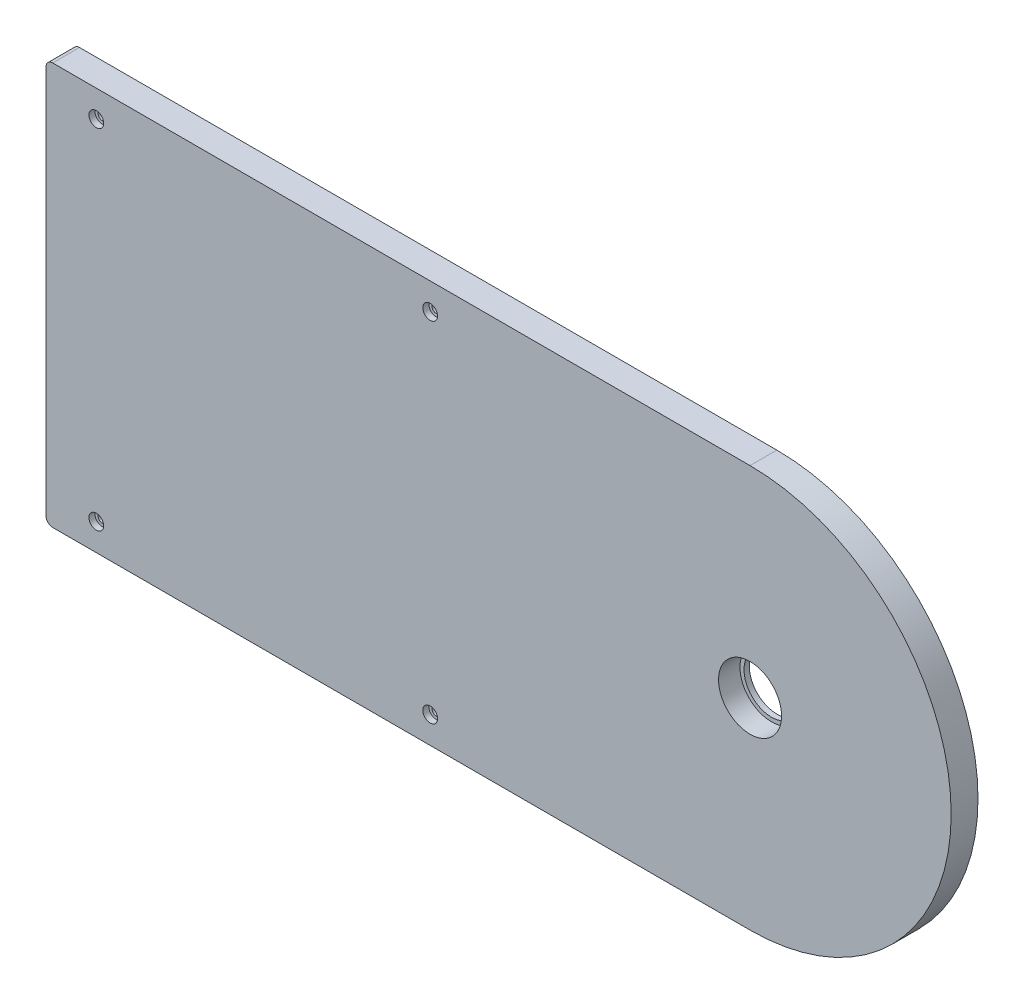
ISO-10303-21;
HEADER;
FILE_DESCRIPTION(('STEP AP214'),'2;1');
FILE_NAME('part.step','',(''),(''),'','','');
FILE_SCHEMA(('AUTOMOTIVE_DESIGN { 1 0 10303 214 1 1 1 1 }'));
ENDSEC;
DATA;
#1=APPLICATION_CONTEXT('core data for automotive mechanical design processes');
#2=APPLICATION_PROTOCOL_DEFINITION('international standard','automotive_design',2000,#1);
#3=PRODUCT_CONTEXT('',#1,'mechanical');
#4=PRODUCT('Part','Part','',(#3));
#5=PRODUCT_RELATED_PRODUCT_CATEGORY('part','',(#4));
#6=PRODUCT_DEFINITION_FORMATION('','',#4);
#7=PRODUCT_DEFINITION_CONTEXT('part definition',#1,'design');
#8=PRODUCT_DEFINITION('design','',#6,#7);
#9=PRODUCT_DEFINITION_SHAPE('','',#8);
#10=(LENGTH_UNIT() NAMED_UNIT(*) SI_UNIT(.MILLI.,.METRE.));
#11=(NAMED_UNIT(*) PLANE_ANGLE_UNIT() SI_UNIT($,.RADIAN.));
#12=(NAMED_UNIT(*) SI_UNIT($,.STERADIAN.) SOLID_ANGLE_UNIT());
#13=UNCERTAINTY_MEASURE_WITH_UNIT(LENGTH_MEASURE(1.E-05),#10,'distance_accuracy_value','');
#14=(GEOMETRIC_REPRESENTATION_CONTEXT(3) GLOBAL_UNCERTAINTY_ASSIGNED_CONTEXT((#13)) GLOBAL_UNIT_ASSIGNED_CONTEXT((#10,
#11,#12)) REPRESENTATION_CONTEXT('',''));
#15=CARTESIAN_POINT('',(0.,0.,0.));
#16=DIRECTION('',(0.,0.,1.));
#17=DIRECTION('',(1.,0.,0.));
#18=AXIS2_PLACEMENT_3D('',#15,#16,#17);
#19=CARTESIAN_POINT('',(-238.5,130.,-3.));
#20=DIRECTION('',(0.,0.,1.));
#21=DIRECTION('',(1.,0.,0.));
#22=AXIS2_PLACEMENT_3D('',#19,#20,#21);
#23=CYLINDRICAL_SURFACE('',#22,3.25000000000001);
#24=CARTESIAN_POINT('',(-238.5,130.,-3.));
#25=DIRECTION('',(0.,0.,1.));
#26=DIRECTION('',(1.,0.,0.));
#27=AXIS2_PLACEMENT_3D('',#24,#25,#26);
#28=CIRCLE('',#27,3.25000000000001);
#29=CARTESIAN_POINT('',(-235.25,130.,-3.));
#30=VERTEX_POINT('',#29);
#31=EDGE_CURVE('E637',#30,#30,#28,.T.);
#32=ORIENTED_EDGE('',*,*,#31,.F.);
#33=EDGE_LOOP('',(#32));
#34=FACE_BOUND('',#33,.T.);
#35=CARTESIAN_POINT('',(-238.5,130.,15.5));
#36=DIRECTION('',(0.,0.,1.));
#37=DIRECTION('',(1.,0.,0.));
#38=AXIS2_PLACEMENT_3D('',#35,#36,#37);
#39=CIRCLE('',#38,3.25000000000001);
#40=CARTESIAN_POINT('',(-235.25,130.,15.5));
#41=VERTEX_POINT('',#40);
#42=EDGE_CURVE('E284',#41,#41,#39,.F.);
#43=ORIENTED_EDGE('',*,*,#42,.F.);
#44=EDGE_LOOP('',(#43));
#45=FACE_BOUND('',#44,.T.);
#46=ADVANCED_FACE('F39',(#34,#45),#23,.F.);
#47=CARTESIAN_POINT('',(-487.5,130.,-3.));
#48=DIRECTION('',(0.,0.,1.));
#49=DIRECTION('',(1.,0.,0.));
#50=AXIS2_PLACEMENT_3D('',#47,#48,#49);
#51=CYLINDRICAL_SURFACE('',#50,3.24999999999995);
#52=CARTESIAN_POINT('',(-487.5,130.,-3.));
#53=DIRECTION('',(0.,0.,1.));
#54=DIRECTION('',(1.,0.,0.));
#55=AXIS2_PLACEMENT_3D('',#52,#53,#54);
#56=CIRCLE('',#55,3.24999999999995);
#57=CARTESIAN_POINT('',(-484.25,130.,-3.));
#58=VERTEX_POINT('',#57);
#59=EDGE_CURVE('E633',#58,#58,#56,.T.);
#60=ORIENTED_EDGE('',*,*,#59,.F.);
#61=EDGE_LOOP('',(#60));
#62=FACE_BOUND('',#61,.T.);
#63=CARTESIAN_POINT('',(-487.5,130.,15.5));
#64=DIRECTION('',(0.,0.,1.));
#65=DIRECTION('',(1.,0.,0.));
#66=AXIS2_PLACEMENT_3D('',#63,#64,#65);
#67=CIRCLE('',#66,3.24999999999995);
#68=CARTESIAN_POINT('',(-484.25,130.,15.5));
#69=VERTEX_POINT('',#68);
#70=EDGE_CURVE('E280',#69,#69,#67,.F.);
#71=ORIENTED_EDGE('',*,*,#70,.F.);
#72=EDGE_LOOP('',(#71));
#73=FACE_BOUND('',#72,.T.);
#74=ADVANCED_FACE('F331',(#62,#73),#51,.F.);
#75=CARTESIAN_POINT('',(-487.5,-130.,-3.));
#76=DIRECTION('',(0.,0.,1.));
#77=DIRECTION('',(1.,0.,0.));
#78=AXIS2_PLACEMENT_3D('',#75,#76,#77);
#79=CYLINDRICAL_SURFACE('',#78,3.24999999999995);
#80=CARTESIAN_POINT('',(-487.5,-130.,-3.));
#81=DIRECTION('',(0.,0.,1.));
#82=DIRECTION('',(1.,0.,0.));
#83=AXIS2_PLACEMENT_3D('',#80,#81,#82);
#84=CIRCLE('',#83,3.24999999999995);
#85=CARTESIAN_POINT('',(-484.25,-130.,-3.));
#86=VERTEX_POINT('',#85);
#87=EDGE_CURVE('E629',#86,#86,#84,.T.);
#88=ORIENTED_EDGE('',*,*,#87,.F.);
#89=EDGE_LOOP('',(#88));
#90=FACE_BOUND('',#89,.T.);
#91=CARTESIAN_POINT('',(-487.5,-130.,15.5));
#92=DIRECTION('',(0.,0.,1.));
#93=DIRECTION('',(1.,0.,0.));
#94=AXIS2_PLACEMENT_3D('',#91,#92,#93);
#95=CIRCLE('',#94,3.24999999999995);
#96=CARTESIAN_POINT('',(-484.25,-130.,15.5));
#97=VERTEX_POINT('',#96);
#98=EDGE_CURVE('E275',#97,#97,#95,.F.);
#99=ORIENTED_EDGE('',*,*,#98,.F.);
#100=EDGE_LOOP('',(#99));
#101=FACE_BOUND('',#100,.T.);
#102=ADVANCED_FACE('F337',(#90,#101),#79,.F.);
#103=CARTESIAN_POINT('',(-238.5,-130.,-3.));
#104=DIRECTION('',(0.,0.,1.));
#105=DIRECTION('',(1.,0.,0.));
#106=AXIS2_PLACEMENT_3D('',#103,#104,#105);
#107=CYLINDRICAL_SURFACE('',#106,3.25000000000001);
#108=CARTESIAN_POINT('',(-238.5,-130.,-3.));
#109=DIRECTION('',(0.,0.,1.));
#110=DIRECTION('',(1.,0.,0.));
#111=AXIS2_PLACEMENT_3D('',#108,#109,#110);
#112=CIRCLE('',#111,3.25000000000001);
#113=CARTESIAN_POINT('',(-235.25,-130.,-3.));
#114=VERTEX_POINT('',#113);
#115=EDGE_CURVE('E288',#114,#114,#112,.T.);
#116=ORIENTED_EDGE('',*,*,#115,.F.);
#117=EDGE_LOOP('',(#116));
#118=FACE_BOUND('',#117,.T.);
#119=CARTESIAN_POINT('',(-238.5,-130.,15.5));
#120=DIRECTION('',(0.,0.,1.));
#121=DIRECTION('',(1.,0.,0.));
#122=AXIS2_PLACEMENT_3D('',#119,#120,#121);
#123=CIRCLE('',#122,3.25000000000001);
#124=CARTESIAN_POINT('',(-235.25,-130.,15.5));
#125=VERTEX_POINT('',#124);
#126=EDGE_CURVE('E271',#125,#125,#123,.F.);
#127=ORIENTED_EDGE('',*,*,#126,.F.);
#128=EDGE_LOOP('',(#127));
#129=FACE_BOUND('',#128,.T.);
#130=ADVANCED_FACE('F344',(#118,#129),#107,.F.);
#131=CARTESIAN_POINT('',(0.,0.,0.));
#132=DIRECTION('',(0.,0.,1.));
#133=DIRECTION('',(1.,0.,0.));
#134=AXIS2_PLACEMENT_3D('',#131,#132,#133);
#135=PLANE('',#134);
#136=CARTESIAN_POINT('',(0.,0.,0.));
#137=DIRECTION('',(0.,0.,1.));
#138=DIRECTION('',(1.,0.,0.));
#139=AXIS2_PLACEMENT_3D('',#136,#137,#138);
#140=CIRCLE('',#139,20.5);
#141=CARTESIAN_POINT('',(20.5,0.,0.));
#142=VERTEX_POINT('',#141);
#143=EDGE_CURVE('E228',#142,#142,#140,.T.);
#144=ORIENTED_EDGE('',*,*,#143,.T.);
#145=EDGE_LOOP('',(#144));
#146=FACE_BOUND('',#145,.T.);
#147=DIRECTION('',(0.,-1.,0.));
#148=VECTOR('',#147,1.);
#149=CARTESIAN_POINT('',(-525.,150.,0.));
#150=LINE('',#149,#148);
#151=CARTESIAN_POINT('',(-525.,145.,0.));
#152=VERTEX_POINT('',#151);
#153=CARTESIAN_POINT('',(-525.,134.,0.));
#154=VERTEX_POINT('',#153);
#155=EDGE_CURVE('E170',#152,#154,#150,.T.);
#156=ORIENTED_EDGE('',*,*,#155,.F.);
#157=CARTESIAN_POINT('',(-520.,145.,0.));
#158=DIRECTION('',(0.,0.,1.));
#159=DIRECTION('',(1.,0.,0.));
#160=AXIS2_PLACEMENT_3D('',#157,#158,#159);
#161=CIRCLE('',#160,5.);
#162=CARTESIAN_POINT('',(-520.,150.,0.));
#163=VERTEX_POINT('',#162);
#164=EDGE_CURVE('E297',#152,#163,#161,.F.);
#165=ORIENTED_EDGE('',*,*,#164,.T.);
#166=DIRECTION('',(-1.,0.,0.));
#167=VECTOR('',#166,1.);
#168=CARTESIAN_POINT('',(0.,150.,0.));
#169=LINE('',#168,#167);
#170=CARTESIAN_POINT('',(0.,150.,0.));
#171=VERTEX_POINT('',#170);
#172=EDGE_CURVE('E251',#171,#163,#169,.T.);
#173=ORIENTED_EDGE('',*,*,#172,.F.);
#174=CARTESIAN_POINT('',(0.,0.,0.));
#175=DIRECTION('',(0.,0.,1.));
#176=DIRECTION('',(1.,0.,0.));
#177=AXIS2_PLACEMENT_3D('',#174,#175,#176);
#178=CIRCLE('',#177,150.);
#179=CARTESIAN_POINT('',(0.,-150.,0.));
#180=VERTEX_POINT('',#179);
#181=EDGE_CURVE('E232',#180,#171,#178,.T.);
#182=ORIENTED_EDGE('',*,*,#181,.F.);
#183=DIRECTION('',(1.,0.,0.));
#184=VECTOR('',#183,1.);
#185=CARTESIAN_POINT('',(-525.,-150.,0.));
#186=LINE('',#185,#184);
#187=CARTESIAN_POINT('',(-520.,-150.,0.));
#188=VERTEX_POINT('',#187);
#189=EDGE_CURVE('E238',#188,#180,#186,.T.);
#190=ORIENTED_EDGE('',*,*,#189,.F.);
#191=CARTESIAN_POINT('',(-520.,-145.,0.));
#192=DIRECTION('',(0.,0.,1.));
#193=DIRECTION('',(1.,0.,0.));
#194=AXIS2_PLACEMENT_3D('',#191,#192,#193);
#195=CIRCLE('',#194,5.);
#196=CARTESIAN_POINT('',(-525.,-145.,0.));
#197=VERTEX_POINT('',#196);
#198=EDGE_CURVE('E294',#188,#197,#195,.F.);
#199=ORIENTED_EDGE('',*,*,#198,.T.);
#200=CARTESIAN_POINT('',(-525.,-134.,0.));
#201=VERTEX_POINT('',#200);
#202=EDGE_CURVE('E254',#201,#197,#150,.T.);
#203=ORIENTED_EDGE('',*,*,#202,.F.);
#204=DIRECTION('',(-1.,0.,0.));
#205=VECTOR('',#204,1.);
#206=CARTESIAN_POINT('',(-525.,-134.,0.));
#207=LINE('',#206,#205);
#208=CARTESIAN_POINT('',(-206.25,-134.,0.));
#209=VERTEX_POINT('',#208);
#210=EDGE_CURVE('E188',#209,#201,#207,.T.);
#211=ORIENTED_EDGE('',*,*,#210,.F.);
#212=DIRECTION('',(0.,-1.,0.));
#213=VECTOR('',#212,1.);
#214=CARTESIAN_POINT('',(-206.25,-134.,0.));
#215=LINE('',#214,#213);
#216=CARTESIAN_POINT('',(-206.25,-126.,0.));
#217=VERTEX_POINT('',#216);
#218=EDGE_CURVE('E177',#217,#209,#215,.T.);
#219=ORIENTED_EDGE('',*,*,#218,.F.);
#220=DIRECTION('',(1.,0.,0.));
#221=VECTOR('',#220,1.);
#222=CARTESIAN_POINT('',(-525.,-126.,0.));
#223=LINE('',#222,#221);
#224=CARTESIAN_POINT('',(-525.,-126.,0.));
#225=VERTEX_POINT('',#224);
#226=EDGE_CURVE('E172',#225,#217,#223,.T.);
#227=ORIENTED_EDGE('',*,*,#226,.F.);
#228=CARTESIAN_POINT('',(-525.,126.,0.));
#229=VERTEX_POINT('',#228);
#230=EDGE_CURVE('E257',#229,#225,#150,.T.);
#231=ORIENTED_EDGE('',*,*,#230,.F.);
#232=DIRECTION('',(-1.,0.,0.));
#233=VECTOR('',#232,1.);
#234=CARTESIAN_POINT('',(-525.,126.,0.));
#235=LINE('',#234,#233);
#236=CARTESIAN_POINT('',(-206.25,126.,0.));
#237=VERTEX_POINT('',#236);
#238=EDGE_CURVE('E164',#237,#229,#235,.T.);
#239=ORIENTED_EDGE('',*,*,#238,.F.);
#240=DIRECTION('',(0.,-1.,0.));
#241=VECTOR('',#240,1.);
#242=CARTESIAN_POINT('',(-206.25,126.,0.));
#243=LINE('',#242,#241);
#244=CARTESIAN_POINT('',(-206.25,134.,0.));
#245=VERTEX_POINT('',#244);
#246=EDGE_CURVE('E649',#245,#237,#243,.T.);
#247=ORIENTED_EDGE('',*,*,#246,.F.);
#248=DIRECTION('',(1.,0.,0.));
#249=VECTOR('',#248,1.);
#250=CARTESIAN_POINT('',(-525.,134.,0.));
#251=LINE('',#250,#249);
#252=EDGE_CURVE('E640',#154,#245,#251,.T.);
#253=ORIENTED_EDGE('',*,*,#252,.F.);
#254=EDGE_LOOP('',(#156,#165,#173,#182,#190,#199,#203,#211,#219,#227,#231,#239,#247,#253));
#255=FACE_BOUND('',#254,.T.);
#256=ADVANCED_FACE('F312',(#146,#255),#135,.F.);
#257=CARTESIAN_POINT('',(0.,0.,20.));
#258=DIRECTION('',(0.,0.,-1.));
#259=DIRECTION('',(-1.,0.,0.));
#260=AXIS2_PLACEMENT_3D('',#257,#258,#259);
#261=CYLINDRICAL_SURFACE('',#260,20.5);
#262=ORIENTED_EDGE('',*,*,#143,.F.);
#263=EDGE_LOOP('',(#262));
#264=FACE_BOUND('',#263,.T.);
#265=CARTESIAN_POINT('',(0.,0.,4.));
#266=DIRECTION('',(0.,0.,1.));
#267=DIRECTION('',(1.,0.,0.));
#268=AXIS2_PLACEMENT_3D('',#265,#266,#267);
#269=CIRCLE('',#268,20.5);
#270=CARTESIAN_POINT('',(20.5,0.,4.));
#271=VERTEX_POINT('',#270);
#272=EDGE_CURVE('E224',#271,#271,#269,.T.);
#273=ORIENTED_EDGE('',*,*,#272,.T.);
#274=EDGE_LOOP('',(#273));
#275=FACE_BOUND('',#274,.T.);
#276=ADVANCED_FACE('F384',(#264,#275),#261,.F.);
#277=CARTESIAN_POINT('',(0.,0.,20.));
#278=DIRECTION('',(0.,0.,1.));
#279=DIRECTION('',(1.,0.,0.));
#280=AXIS2_PLACEMENT_3D('',#277,#278,#279);
#281=PLANE('',#280);
#282=CARTESIAN_POINT('',(-487.5,-130.,20.));
#283=DIRECTION('',(0.,0.,1.));
#284=DIRECTION('',(1.,0.,0.));
#285=AXIS2_PLACEMENT_3D('',#282,#283,#284);
#286=CIRCLE('',#285,5.49999999999996);
#287=CARTESIAN_POINT('',(-482.,-130.,20.));
#288=VERTEX_POINT('',#287);
#289=EDGE_CURVE('E685',#288,#288,#286,.T.);
#290=ORIENTED_EDGE('',*,*,#289,.F.);
#291=EDGE_LOOP('',(#290));
#292=FACE_BOUND('',#291,.T.);
#293=CARTESIAN_POINT('',(-238.5,-130.,20.));
#294=DIRECTION('',(0.,0.,1.));
#295=DIRECTION('',(1.,0.,0.));
#296=AXIS2_PLACEMENT_3D('',#293,#294,#295);
#297=CIRCLE('',#296,5.50000000000002);
#298=CARTESIAN_POINT('',(-233.,-130.,20.));
#299=VERTEX_POINT('',#298);
#300=EDGE_CURVE('E693',#299,#299,#297,.T.);
#301=ORIENTED_EDGE('',*,*,#300,.F.);
#302=EDGE_LOOP('',(#301));
#303=FACE_BOUND('',#302,.T.);
#304=CARTESIAN_POINT('',(-238.5,130.,20.));
#305=DIRECTION('',(0.,0.,1.));
#306=DIRECTION('',(1.,0.,0.));
#307=AXIS2_PLACEMENT_3D('',#304,#305,#306);
#308=CIRCLE('',#307,5.50000000000002);
#309=CARTESIAN_POINT('',(-233.,130.,20.));
#310=VERTEX_POINT('',#309);
#311=EDGE_CURVE('E701',#310,#310,#308,.T.);
#312=ORIENTED_EDGE('',*,*,#311,.F.);
#313=EDGE_LOOP('',(#312));
#314=FACE_BOUND('',#313,.T.);
#315=CARTESIAN_POINT('',(-487.5,130.,20.));
#316=DIRECTION('',(0.,0.,1.));
#317=DIRECTION('',(1.,0.,0.));
#318=AXIS2_PLACEMENT_3D('',#315,#316,#317);
#319=CIRCLE('',#318,5.49999999999996);
#320=CARTESIAN_POINT('',(-482.,130.,20.));
#321=VERTEX_POINT('',#320);
#322=EDGE_CURVE('E677',#321,#321,#319,.T.);
#323=ORIENTED_EDGE('',*,*,#322,.F.);
#324=EDGE_LOOP('',(#323));
#325=FACE_BOUND('',#324,.T.);
#326=CARTESIAN_POINT('',(0.,0.,20.));
#327=DIRECTION('',(0.,0.,1.));
#328=DIRECTION('',(1.,0.,0.));
#329=AXIS2_PLACEMENT_3D('',#326,#327,#328);
#330=CIRCLE('',#329,23.5);
#331=CARTESIAN_POINT('',(23.5,0.,20.));
#332=VERTEX_POINT('',#331);
#333=EDGE_CURVE('E219',#332,#332,#330,.T.);
#334=ORIENTED_EDGE('',*,*,#333,.F.);
#335=EDGE_LOOP('',(#334));
#336=FACE_BOUND('',#335,.T.);
#337=DIRECTION('',(-1.,0.,0.));
#338=VECTOR('',#337,1.);
#339=CARTESIAN_POINT('',(0.,150.,20.));
#340=LINE('',#339,#338);
#341=CARTESIAN_POINT('',(0.,150.,20.));
#342=VERTEX_POINT('',#341);
#343=CARTESIAN_POINT('',(-520.,150.,20.));
#344=VERTEX_POINT('',#343);
#345=EDGE_CURVE('E237',#342,#344,#340,.T.);
#346=ORIENTED_EDGE('',*,*,#345,.T.);
#347=CARTESIAN_POINT('',(-520.,145.,20.));
#348=DIRECTION('',(0.,0.,1.));
#349=DIRECTION('',(1.,0.,0.));
#350=AXIS2_PLACEMENT_3D('',#347,#348,#349);
#351=CIRCLE('',#350,5.);
#352=CARTESIAN_POINT('',(-525.,145.,20.));
#353=VERTEX_POINT('',#352);
#354=EDGE_CURVE('E48',#344,#353,#351,.T.);
#355=ORIENTED_EDGE('',*,*,#354,.T.);
#356=DIRECTION('',(0.,-1.,0.));
#357=VECTOR('',#356,1.);
#358=CARTESIAN_POINT('',(-525.,150.,20.));
#359=LINE('',#358,#357);
#360=CARTESIAN_POINT('',(-525.,-145.,20.));
#361=VERTEX_POINT('',#360);
#362=EDGE_CURVE('E241',#353,#361,#359,.T.);
#363=ORIENTED_EDGE('',*,*,#362,.T.);
#364=CARTESIAN_POINT('',(-520.,-145.,20.));
#365=DIRECTION('',(0.,0.,1.));
#366=DIRECTION('',(1.,0.,0.));
#367=AXIS2_PLACEMENT_3D('',#364,#365,#366);
#368=CIRCLE('',#367,5.);
#369=CARTESIAN_POINT('',(-520.,-150.,20.));
#370=VERTEX_POINT('',#369);
#371=EDGE_CURVE('E55',#361,#370,#368,.T.);
#372=ORIENTED_EDGE('',*,*,#371,.T.);
#373=DIRECTION('',(1.,0.,0.));
#374=VECTOR('',#373,1.);
#375=CARTESIAN_POINT('',(-525.,-150.,20.));
#376=LINE('',#375,#374);
#377=CARTESIAN_POINT('',(0.,-150.,20.));
#378=VERTEX_POINT('',#377);
#379=EDGE_CURVE('E244',#370,#378,#376,.T.);
#380=ORIENTED_EDGE('',*,*,#379,.T.);
#381=CARTESIAN_POINT('',(0.,0.,20.));
#382=DIRECTION('',(0.,0.,1.));
#383=DIRECTION('',(1.,0.,0.));
#384=AXIS2_PLACEMENT_3D('',#381,#382,#383);
#385=CIRCLE('',#384,150.);
#386=EDGE_CURVE('E233',#378,#342,#385,.T.);
#387=ORIENTED_EDGE('',*,*,#386,.T.);
#388=EDGE_LOOP('',(#346,#355,#363,#372,#380,#387));
#389=FACE_BOUND('',#388,.T.);
#390=ADVANCED_FACE('F305',(#292,#303,#314,#325,#336,#389),#281,.T.);
#391=CARTESIAN_POINT('',(0.,0.,20.));
#392=DIRECTION('',(0.,0.,-1.));
#393=DIRECTION('',(-1.,0.,0.));
#394=AXIS2_PLACEMENT_3D('',#391,#392,#393);
#395=CYLINDRICAL_SURFACE('',#394,150.);
#396=ORIENTED_EDGE('',*,*,#181,.T.);
#397=DIRECTION('',(0.,0.,-1.));
#398=VECTOR('',#397,1.);
#399=CARTESIAN_POINT('',(0.,150.,20.));
#400=LINE('',#399,#398);
#401=EDGE_CURVE('E263',#342,#171,#400,.T.);
#402=ORIENTED_EDGE('',*,*,#401,.F.);
#403=ORIENTED_EDGE('',*,*,#386,.F.);
#404=DIRECTION('',(0.,0.,-1.));
#405=VECTOR('',#404,1.);
#406=CARTESIAN_POINT('',(0.,-150.,20.));
#407=LINE('',#406,#405);
#408=EDGE_CURVE('E247',#378,#180,#407,.T.);
#409=ORIENTED_EDGE('',*,*,#408,.T.);
#410=EDGE_LOOP('',(#396,#402,#403,#409));
#411=FACE_BOUND('',#410,.T.);
#412=ADVANCED_FACE('F318',(#411),#395,.T.);
#413=CARTESIAN_POINT('',(0.,150.,20.));
#414=DIRECTION('',(0.,-1.,0.));
#415=DIRECTION('',(0.,0.,-1.));
#416=AXIS2_PLACEMENT_3D('',#413,#414,#415);
#417=PLANE('',#416);
#418=ORIENTED_EDGE('',*,*,#172,.T.);
#419=DIRECTION('',(0.,0.,-1.));
#420=VECTOR('',#419,1.);
#421=CARTESIAN_POINT('',(-520.,150.,20.));
#422=LINE('',#421,#420);
#423=EDGE_CURVE('E63',#163,#344,#422,.F.);
#424=ORIENTED_EDGE('',*,*,#423,.T.);
#425=ORIENTED_EDGE('',*,*,#345,.F.);
#426=ORIENTED_EDGE('',*,*,#401,.T.);
#427=EDGE_LOOP('',(#418,#424,#425,#426));
#428=FACE_BOUND('',#427,.T.);
#429=ADVANCED_FACE('F314',(#428),#417,.F.);
#430=CARTESIAN_POINT('',(-525.,150.,20.));
#431=DIRECTION('',(1.,0.,0.));
#432=DIRECTION('',(0.,0.,-1.));
#433=AXIS2_PLACEMENT_3D('',#430,#431,#432);
#434=PLANE('',#433);
#435=ORIENTED_EDGE('',*,*,#362,.F.);
#436=DIRECTION('',(0.,0.,-1.));
#437=VECTOR('',#436,1.);
#438=CARTESIAN_POINT('',(-525.,145.,20.));
#439=LINE('',#438,#437);
#440=EDGE_CURVE('E291',#353,#152,#439,.T.);
#441=ORIENTED_EDGE('',*,*,#440,.T.);
#442=ORIENTED_EDGE('',*,*,#155,.T.);
#443=DIRECTION('',(0.,0.,1.));
#444=VECTOR('',#443,1.);
#445=CARTESIAN_POINT('',(-525.,134.,-3.));
#446=LINE('',#445,#444);
#447=CARTESIAN_POINT('',(-525.,134.,-3.));
#448=VERTEX_POINT('',#447);
#449=EDGE_CURVE('E147',#448,#154,#446,.T.);
#450=ORIENTED_EDGE('',*,*,#449,.F.);
#451=DIRECTION('',(0.,1.,0.));
#452=VECTOR('',#451,1.);
#453=CARTESIAN_POINT('',(-525.,126.,-3.));
#454=LINE('',#453,#452);
#455=CARTESIAN_POINT('',(-525.,126.,-3.));
#456=VERTEX_POINT('',#455);
#457=EDGE_CURVE('E155',#456,#448,#454,.T.);
#458=ORIENTED_EDGE('',*,*,#457,.F.);
#459=DIRECTION('',(0.,0.,1.));
#460=VECTOR('',#459,1.);
#461=CARTESIAN_POINT('',(-525.,126.,-3.));
#462=LINE('',#461,#460);
#463=EDGE_CURVE('E646',#456,#229,#462,.T.);
#464=ORIENTED_EDGE('',*,*,#463,.T.);
#465=ORIENTED_EDGE('',*,*,#230,.T.);
#466=DIRECTION('',(0.,0.,1.));
#467=VECTOR('',#466,1.);
#468=CARTESIAN_POINT('',(-525.,-126.,-3.));
#469=LINE('',#468,#467);
#470=CARTESIAN_POINT('',(-525.,-126.,-3.));
#471=VERTEX_POINT('',#470);
#472=EDGE_CURVE('E215',#471,#225,#469,.T.);
#473=ORIENTED_EDGE('',*,*,#472,.F.);
#474=DIRECTION('',(0.,1.,0.));
#475=VECTOR('',#474,1.);
#476=CARTESIAN_POINT('',(-525.,-134.,-3.));
#477=LINE('',#476,#475);
#478=CARTESIAN_POINT('',(-525.,-134.,-3.));
#479=VERTEX_POINT('',#478);
#480=EDGE_CURVE('E183',#479,#471,#477,.T.);
#481=ORIENTED_EDGE('',*,*,#480,.F.);
#482=DIRECTION('',(0.,0.,1.));
#483=VECTOR('',#482,1.);
#484=CARTESIAN_POINT('',(-525.,-134.,-3.));
#485=LINE('',#484,#483);
#486=EDGE_CURVE('E196',#479,#201,#485,.T.);
#487=ORIENTED_EDGE('',*,*,#486,.T.);
#488=ORIENTED_EDGE('',*,*,#202,.T.);
#489=DIRECTION('',(0.,0.,-1.));
#490=VECTOR('',#489,1.);
#491=CARTESIAN_POINT('',(-525.,-145.,20.));
#492=LINE('',#491,#490);
#493=EDGE_CURVE('E267',#197,#361,#492,.F.);
#494=ORIENTED_EDGE('',*,*,#493,.T.);
#495=EDGE_LOOP('',(#435,#441,#442,#450,#458,#464,#465,#473,#481,#487,#488,#494));
#496=FACE_BOUND('',#495,.T.);
#497=ADVANCED_FACE('F167',(#496),#434,.F.);
#498=CARTESIAN_POINT('',(-525.,-150.,20.));
#499=DIRECTION('',(0.,1.,0.));
#500=DIRECTION('',(0.,0.,1.));
#501=AXIS2_PLACEMENT_3D('',#498,#499,#500);
#502=PLANE('',#501);
#503=ORIENTED_EDGE('',*,*,#379,.F.);
#504=DIRECTION('',(0.,0.,-1.));
#505=VECTOR('',#504,1.);
#506=CARTESIAN_POINT('',(-520.,-150.,20.));
#507=LINE('',#506,#505);
#508=EDGE_CURVE('E11',#370,#188,#507,.T.);
#509=ORIENTED_EDGE('',*,*,#508,.T.);
#510=ORIENTED_EDGE('',*,*,#189,.T.);
#511=ORIENTED_EDGE('',*,*,#408,.F.);
#512=EDGE_LOOP('',(#503,#509,#510,#511));
#513=FACE_BOUND('',#512,.T.);
#514=ADVANCED_FACE('F322',(#513),#502,.F.);
#515=CARTESIAN_POINT('',(0.,0.,4.));
#516=DIRECTION('',(0.,0.,1.));
#517=DIRECTION('',(1.,0.,0.));
#518=AXIS2_PLACEMENT_3D('',#515,#516,#517);
#519=CYLINDRICAL_SURFACE('',#518,23.5);
#520=CARTESIAN_POINT('',(0.,0.,4.));
#521=DIRECTION('',(0.,0.,1.));
#522=DIRECTION('',(1.,0.,0.));
#523=AXIS2_PLACEMENT_3D('',#520,#521,#522);
#524=CIRCLE('',#523,23.5);
#525=CARTESIAN_POINT('',(23.5,0.,4.));
#526=VERTEX_POINT('',#525);
#527=EDGE_CURVE('E220',#526,#526,#524,.T.);
#528=ORIENTED_EDGE('',*,*,#527,.F.);
#529=EDGE_LOOP('',(#528));
#530=FACE_BOUND('',#529,.T.);
#531=ORIENTED_EDGE('',*,*,#333,.T.);
#532=EDGE_LOOP('',(#531));
#533=FACE_BOUND('',#532,.T.);
#534=ADVANCED_FACE('F379',(#530,#533),#519,.F.);
#535=CARTESIAN_POINT('',(0.,0.,4.));
#536=DIRECTION('',(0.,0.,1.));
#537=DIRECTION('',(1.,0.,0.));
#538=AXIS2_PLACEMENT_3D('',#535,#536,#537);
#539=PLANE('',#538);
#540=ORIENTED_EDGE('',*,*,#272,.F.);
#541=EDGE_LOOP('',(#540));
#542=FACE_BOUND('',#541,.T.);
#543=ORIENTED_EDGE('',*,*,#527,.T.);
#544=EDGE_LOOP('',(#543));
#545=FACE_BOUND('',#544,.T.);
#546=ADVANCED_FACE('F375',(#542,#545),#539,.T.);
#547=CARTESIAN_POINT('',(-525.,-126.,-3.));
#548=DIRECTION('',(0.,-1.,0.));
#549=DIRECTION('',(0.,0.,-1.));
#550=AXIS2_PLACEMENT_3D('',#547,#548,#549);
#551=PLANE('',#550);
#552=ORIENTED_EDGE('',*,*,#226,.T.);
#553=DIRECTION('',(0.,0.,1.));
#554=VECTOR('',#553,1.);
#555=CARTESIAN_POINT('',(-206.25,-126.,-3.));
#556=LINE('',#555,#554);
#557=CARTESIAN_POINT('',(-206.25,-126.,-3.));
#558=VERTEX_POINT('',#557);
#559=EDGE_CURVE('E211',#558,#217,#556,.T.);
#560=ORIENTED_EDGE('',*,*,#559,.F.);
#561=DIRECTION('',(1.,0.,0.));
#562=VECTOR('',#561,1.);
#563=CARTESIAN_POINT('',(-525.,-126.,-3.));
#564=LINE('',#563,#562);
#565=EDGE_CURVE('E187',#471,#558,#564,.T.);
#566=ORIENTED_EDGE('',*,*,#565,.F.);
#567=ORIENTED_EDGE('',*,*,#472,.T.);
#568=EDGE_LOOP('',(#552,#560,#566,#567));
#569=FACE_BOUND('',#568,.T.);
#570=ADVANCED_FACE('F371',(#569),#551,.F.);
#571=CARTESIAN_POINT('',(-206.25,-134.,-3.));
#572=DIRECTION('',(-1.,0.,0.));
#573=DIRECTION('',(0.,0.,1.));
#574=AXIS2_PLACEMENT_3D('',#571,#572,#573);
#575=PLANE('',#574);
#576=ORIENTED_EDGE('',*,*,#218,.T.);
#577=DIRECTION('',(0.,0.,1.));
#578=VECTOR('',#577,1.);
#579=CARTESIAN_POINT('',(-206.25,-134.,-3.));
#580=LINE('',#579,#578);
#581=CARTESIAN_POINT('',(-206.25,-134.,-3.));
#582=VERTEX_POINT('',#581);
#583=EDGE_CURVE('E207',#582,#209,#580,.T.);
#584=ORIENTED_EDGE('',*,*,#583,.F.);
#585=DIRECTION('',(0.,-1.,0.));
#586=VECTOR('',#585,1.);
#587=CARTESIAN_POINT('',(-206.25,-134.,-3.));
#588=LINE('',#587,#586);
#589=EDGE_CURVE('E191',#558,#582,#588,.T.);
#590=ORIENTED_EDGE('',*,*,#589,.F.);
#591=ORIENTED_EDGE('',*,*,#559,.T.);
#592=EDGE_LOOP('',(#576,#584,#590,#591));
#593=FACE_BOUND('',#592,.T.);
#594=ADVANCED_FACE('F367',(#593),#575,.F.);
#595=CARTESIAN_POINT('',(-525.,-134.,-3.));
#596=DIRECTION('',(0.,1.,0.));
#597=DIRECTION('',(-1.,0.,0.));
#598=AXIS2_PLACEMENT_3D('',#595,#596,#597);
#599=PLANE('',#598);
#600=ORIENTED_EDGE('',*,*,#210,.T.);
#601=ORIENTED_EDGE('',*,*,#486,.F.);
#602=DIRECTION('',(-1.,0.,0.));
#603=VECTOR('',#602,1.);
#604=CARTESIAN_POINT('',(-525.,-134.,-3.));
#605=LINE('',#604,#603);
#606=EDGE_CURVE('E194',#582,#479,#605,.T.);
#607=ORIENTED_EDGE('',*,*,#606,.F.);
#608=ORIENTED_EDGE('',*,*,#583,.T.);
#609=EDGE_LOOP('',(#600,#601,#607,#608));
#610=FACE_BOUND('',#609,.T.);
#611=ADVANCED_FACE('F363',(#610),#599,.F.);
#612=CARTESIAN_POINT('',(0.,0.,-3.));
#613=DIRECTION('',(0.,0.,-1.));
#614=DIRECTION('',(-1.,0.,0.));
#615=AXIS2_PLACEMENT_3D('',#612,#613,#614);
#616=PLANE('',#615);
#617=ORIENTED_EDGE('',*,*,#115,.T.);
#618=EDGE_LOOP('',(#617));
#619=FACE_BOUND('',#618,.T.);
#620=ORIENTED_EDGE('',*,*,#87,.T.);
#621=EDGE_LOOP('',(#620));
#622=FACE_BOUND('',#621,.T.);
#623=ORIENTED_EDGE('',*,*,#480,.T.);
#624=ORIENTED_EDGE('',*,*,#565,.T.);
#625=ORIENTED_EDGE('',*,*,#589,.T.);
#626=ORIENTED_EDGE('',*,*,#606,.T.);
#627=EDGE_LOOP('',(#623,#624,#625,#626));
#628=FACE_BOUND('',#627,.T.);
#629=ADVANCED_FACE('F360',(#619,#622,#628),#616,.T.);
#630=CARTESIAN_POINT('',(-525.,134.,-3.));
#631=DIRECTION('',(0.,-1.,0.));
#632=DIRECTION('',(1.,0.,0.));
#633=AXIS2_PLACEMENT_3D('',#630,#631,#632);
#634=PLANE('',#633);
#635=ORIENTED_EDGE('',*,*,#252,.T.);
#636=DIRECTION('',(0.,0.,1.));
#637=VECTOR('',#636,1.);
#638=CARTESIAN_POINT('',(-206.25,134.,-3.));
#639=LINE('',#638,#637);
#640=CARTESIAN_POINT('',(-206.25,134.,-3.));
#641=VERTEX_POINT('',#640);
#642=EDGE_CURVE('E150',#641,#245,#639,.T.);
#643=ORIENTED_EDGE('',*,*,#642,.F.);
#644=DIRECTION('',(1.,0.,0.));
#645=VECTOR('',#644,1.);
#646=CARTESIAN_POINT('',(-525.,134.,-3.));
#647=LINE('',#646,#645);
#648=EDGE_CURVE('E143',#448,#641,#647,.T.);
#649=ORIENTED_EDGE('',*,*,#648,.F.);
#650=ORIENTED_EDGE('',*,*,#449,.T.);
#651=EDGE_LOOP('',(#635,#643,#649,#650));
#652=FACE_BOUND('',#651,.T.);
#653=ADVANCED_FACE('F145',(#652),#634,.F.);
#654=CARTESIAN_POINT('',(-206.25,126.,-3.));
#655=DIRECTION('',(-1.,0.,0.));
#656=DIRECTION('',(0.,0.,1.));
#657=AXIS2_PLACEMENT_3D('',#654,#655,#656);
#658=PLANE('',#657);
#659=ORIENTED_EDGE('',*,*,#246,.T.);
#660=DIRECTION('',(0.,0.,1.));
#661=VECTOR('',#660,1.);
#662=CARTESIAN_POINT('',(-206.25,126.,-3.));
#663=LINE('',#662,#661);
#664=CARTESIAN_POINT('',(-206.25,126.,-3.));
#665=VERTEX_POINT('',#664);
#666=EDGE_CURVE('E179',#665,#237,#663,.T.);
#667=ORIENTED_EDGE('',*,*,#666,.F.);
#668=DIRECTION('',(0.,-1.,0.));
#669=VECTOR('',#668,1.);
#670=CARTESIAN_POINT('',(-206.25,126.,-3.));
#671=LINE('',#670,#669);
#672=EDGE_CURVE('E154',#641,#665,#671,.T.);
#673=ORIENTED_EDGE('',*,*,#672,.F.);
#674=ORIENTED_EDGE('',*,*,#642,.T.);
#675=EDGE_LOOP('',(#659,#667,#673,#674));
#676=FACE_BOUND('',#675,.T.);
#677=ADVANCED_FACE('F353',(#676),#658,.F.);
#678=CARTESIAN_POINT('',(-525.,126.,-3.));
#679=DIRECTION('',(0.,1.,0.));
#680=DIRECTION('',(-1.,0.,0.));
#681=AXIS2_PLACEMENT_3D('',#678,#679,#680);
#682=PLANE('',#681);
#683=ORIENTED_EDGE('',*,*,#238,.T.);
#684=ORIENTED_EDGE('',*,*,#463,.F.);
#685=DIRECTION('',(-1.,0.,0.));
#686=VECTOR('',#685,1.);
#687=CARTESIAN_POINT('',(-525.,126.,-3.));
#688=LINE('',#687,#686);
#689=EDGE_CURVE('E160',#665,#456,#688,.T.);
#690=ORIENTED_EDGE('',*,*,#689,.F.);
#691=ORIENTED_EDGE('',*,*,#666,.T.);
#692=EDGE_LOOP('',(#683,#684,#690,#691));
#693=FACE_BOUND('',#692,.T.);
#694=ADVANCED_FACE('F349',(#693),#682,.F.);
#695=CARTESIAN_POINT('',(0.,0.,-3.));
#696=DIRECTION('',(0.,0.,-1.));
#697=DIRECTION('',(-1.,0.,0.));
#698=AXIS2_PLACEMENT_3D('',#695,#696,#697);
#699=PLANE('',#698);
#700=ORIENTED_EDGE('',*,*,#59,.T.);
#701=EDGE_LOOP('',(#700));
#702=FACE_BOUND('',#701,.T.);
#703=ORIENTED_EDGE('',*,*,#31,.T.);
#704=EDGE_LOOP('',(#703));
#705=FACE_BOUND('',#704,.T.);
#706=ORIENTED_EDGE('',*,*,#457,.T.);
#707=ORIENTED_EDGE('',*,*,#648,.T.);
#708=ORIENTED_EDGE('',*,*,#672,.T.);
#709=ORIENTED_EDGE('',*,*,#689,.T.);
#710=EDGE_LOOP('',(#706,#707,#708,#709));
#711=FACE_BOUND('',#710,.T.);
#712=ADVANCED_FACE('F158',(#702,#705,#711),#699,.T.);
#713=CARTESIAN_POINT('',(-238.5,-130.,15.5));
#714=DIRECTION('',(0.,0.,1.));
#715=DIRECTION('',(1.,0.,0.));
#716=AXIS2_PLACEMENT_3D('',#713,#714,#715);
#717=PLANE('',#716);
#718=CARTESIAN_POINT('',(-238.5,-130.,15.5));
#719=DIRECTION('',(0.,0.,1.));
#720=DIRECTION('',(1.,0.,0.));
#721=AXIS2_PLACEMENT_3D('',#718,#719,#720);
#722=CIRCLE('',#721,5.50000000000002);
#723=CARTESIAN_POINT('',(-233.,-130.,15.5));
#724=VERTEX_POINT('',#723);
#725=EDGE_CURVE('E697',#724,#724,#722,.T.);
#726=ORIENTED_EDGE('',*,*,#725,.T.);
#727=EDGE_LOOP('',(#726));
#728=FACE_BOUND('',#727,.T.);
#729=ORIENTED_EDGE('',*,*,#126,.T.);
#730=EDGE_LOOP('',(#729));
#731=FACE_BOUND('',#730,.T.);
#732=ADVANCED_FACE('F348',(#728,#731),#717,.T.);
#733=CARTESIAN_POINT('',(-238.5,-130.,15.5));
#734=DIRECTION('',(0.,0.,1.));
#735=DIRECTION('',(1.,0.,0.));
#736=AXIS2_PLACEMENT_3D('',#733,#734,#735);
#737=CYLINDRICAL_SURFACE('',#736,5.50000000000002);
#738=ORIENTED_EDGE('',*,*,#725,.F.);
#739=EDGE_LOOP('',(#738));
#740=FACE_BOUND('',#739,.T.);
#741=ORIENTED_EDGE('',*,*,#300,.T.);
#742=EDGE_LOOP('',(#741));
#743=FACE_BOUND('',#742,.T.);
#744=ADVANCED_FACE('F465',(#740,#743),#737,.F.);
#745=CARTESIAN_POINT('',(-487.5,-130.,15.5));
#746=DIRECTION('',(0.,0.,1.));
#747=DIRECTION('',(1.,0.,0.));
#748=AXIS2_PLACEMENT_3D('',#745,#746,#747);
#749=PLANE('',#748);
#750=CARTESIAN_POINT('',(-487.5,-130.,15.5));
#751=DIRECTION('',(0.,0.,1.));
#752=DIRECTION('',(1.,0.,0.));
#753=AXIS2_PLACEMENT_3D('',#750,#751,#752);
#754=CIRCLE('',#753,5.49999999999996);
#755=CARTESIAN_POINT('',(-482.,-130.,15.5));
#756=VERTEX_POINT('',#755);
#757=EDGE_CURVE('E689',#756,#756,#754,.T.);
#758=ORIENTED_EDGE('',*,*,#757,.T.);
#759=EDGE_LOOP('',(#758));
#760=FACE_BOUND('',#759,.T.);
#761=ORIENTED_EDGE('',*,*,#98,.T.);
#762=EDGE_LOOP('',(#761));
#763=FACE_BOUND('',#762,.T.);
#764=ADVANCED_FACE('F474',(#760,#763),#749,.T.);
#765=CARTESIAN_POINT('',(-487.5,-130.,15.5));
#766=DIRECTION('',(0.,0.,1.));
#767=DIRECTION('',(1.,0.,0.));
#768=AXIS2_PLACEMENT_3D('',#765,#766,#767);
#769=CYLINDRICAL_SURFACE('',#768,5.49999999999996);
#770=ORIENTED_EDGE('',*,*,#757,.F.);
#771=EDGE_LOOP('',(#770));
#772=FACE_BOUND('',#771,.T.);
#773=ORIENTED_EDGE('',*,*,#289,.T.);
#774=EDGE_LOOP('',(#773));
#775=FACE_BOUND('',#774,.T.);
#776=ADVANCED_FACE('F482',(#772,#775),#769,.F.);
#777=CARTESIAN_POINT('',(-487.5,130.,15.5));
#778=DIRECTION('',(0.,0.,1.));
#779=DIRECTION('',(1.,0.,0.));
#780=AXIS2_PLACEMENT_3D('',#777,#778,#779);
#781=PLANE('',#780);
#782=CARTESIAN_POINT('',(-487.5,130.,15.5));
#783=DIRECTION('',(0.,0.,1.));
#784=DIRECTION('',(1.,0.,0.));
#785=AXIS2_PLACEMENT_3D('',#782,#783,#784);
#786=CIRCLE('',#785,5.49999999999996);
#787=CARTESIAN_POINT('',(-482.,130.,15.5));
#788=VERTEX_POINT('',#787);
#789=EDGE_CURVE('E276',#788,#788,#786,.T.);
#790=ORIENTED_EDGE('',*,*,#789,.T.);
#791=EDGE_LOOP('',(#790));
#792=FACE_BOUND('',#791,.T.);
#793=ORIENTED_EDGE('',*,*,#70,.T.);
#794=EDGE_LOOP('',(#793));
#795=FACE_BOUND('',#794,.T.);
#796=ADVANCED_FACE('F490',(#792,#795),#781,.T.);
#797=CARTESIAN_POINT('',(-487.5,130.,15.5));
#798=DIRECTION('',(0.,0.,1.));
#799=DIRECTION('',(1.,0.,0.));
#800=AXIS2_PLACEMENT_3D('',#797,#798,#799);
#801=CYLINDRICAL_SURFACE('',#800,5.49999999999996);
#802=ORIENTED_EDGE('',*,*,#789,.F.);
#803=EDGE_LOOP('',(#802));
#804=FACE_BOUND('',#803,.T.);
#805=ORIENTED_EDGE('',*,*,#322,.T.);
#806=EDGE_LOOP('',(#805));
#807=FACE_BOUND('',#806,.T.);
#808=ADVANCED_FACE('F498',(#804,#807),#801,.F.);
#809=CARTESIAN_POINT('',(-238.5,130.,15.5));
#810=DIRECTION('',(0.,0.,1.));
#811=DIRECTION('',(1.,0.,0.));
#812=AXIS2_PLACEMENT_3D('',#809,#810,#811);
#813=PLANE('',#812);
#814=CARTESIAN_POINT('',(-238.5,130.,15.5));
#815=DIRECTION('',(0.,0.,1.));
#816=DIRECTION('',(1.,0.,0.));
#817=AXIS2_PLACEMENT_3D('',#814,#815,#816);
#818=CIRCLE('',#817,5.50000000000002);
#819=CARTESIAN_POINT('',(-233.,130.,15.5));
#820=VERTEX_POINT('',#819);
#821=EDGE_CURVE('E681',#820,#820,#818,.T.);
#822=ORIENTED_EDGE('',*,*,#821,.T.);
#823=EDGE_LOOP('',(#822));
#824=FACE_BOUND('',#823,.T.);
#825=ORIENTED_EDGE('',*,*,#42,.T.);
#826=EDGE_LOOP('',(#825));
#827=FACE_BOUND('',#826,.T.);
#828=ADVANCED_FACE('F506',(#824,#827),#813,.T.);
#829=CARTESIAN_POINT('',(-238.5,130.,15.5));
#830=DIRECTION('',(0.,0.,1.));
#831=DIRECTION('',(1.,0.,0.));
#832=AXIS2_PLACEMENT_3D('',#829,#830,#831);
#833=CYLINDRICAL_SURFACE('',#832,5.50000000000002);
#834=ORIENTED_EDGE('',*,*,#821,.F.);
#835=EDGE_LOOP('',(#834));
#836=FACE_BOUND('',#835,.T.);
#837=ORIENTED_EDGE('',*,*,#311,.T.);
#838=EDGE_LOOP('',(#837));
#839=FACE_BOUND('',#838,.T.);
#840=ADVANCED_FACE('F329',(#836,#839),#833,.F.);
#841=CARTESIAN_POINT('',(-520.,145.,20.));
#842=DIRECTION('',(0.,0.,-1.));
#843=DIRECTION('',(-1.,0.,0.));
#844=AXIS2_PLACEMENT_3D('',#841,#842,#843);
#845=CYLINDRICAL_SURFACE('',#844,5.);
#846=ORIENTED_EDGE('',*,*,#354,.F.);
#847=ORIENTED_EDGE('',*,*,#423,.F.);
#848=ORIENTED_EDGE('',*,*,#164,.F.);
#849=ORIENTED_EDGE('',*,*,#440,.F.);
#850=EDGE_LOOP('',(#846,#847,#848,#849));
#851=FACE_BOUND('',#850,.T.);
#852=ADVANCED_FACE('F310',(#851),#845,.T.);
#853=CARTESIAN_POINT('',(-520.,-145.,20.));
#854=DIRECTION('',(0.,0.,-1.));
#855=DIRECTION('',(-1.,0.,0.));
#856=AXIS2_PLACEMENT_3D('',#853,#854,#855);
#857=CYLINDRICAL_SURFACE('',#856,5.);
#858=ORIENTED_EDGE('',*,*,#371,.F.);
#859=ORIENTED_EDGE('',*,*,#493,.F.);
#860=ORIENTED_EDGE('',*,*,#198,.F.);
#861=ORIENTED_EDGE('',*,*,#508,.F.);
#862=EDGE_LOOP('',(#858,#859,#860,#861));
#863=FACE_BOUND('',#862,.T.);
#864=ADVANCED_FACE('F41',(#863),#857,.T.);
#865=CLOSED_SHELL('',(#46,#74,#102,#130,#256,#276,#390,#412,#429,#497,#514,#534,#546,#570,#594,
#611,#629,#653,#677,#694,#712,#732,#744,#764,#776,#796,#808,#828,#840,#852,#864));
#866=MANIFOLD_SOLID_BREP('B2',#865);
#867=ADVANCED_BREP_SHAPE_REPRESENTATION('',(#18,#866),#14);
#868=SHAPE_DEFINITION_REPRESENTATION(#9,#867);
ENDSEC;
END-ISO-10303-21;
